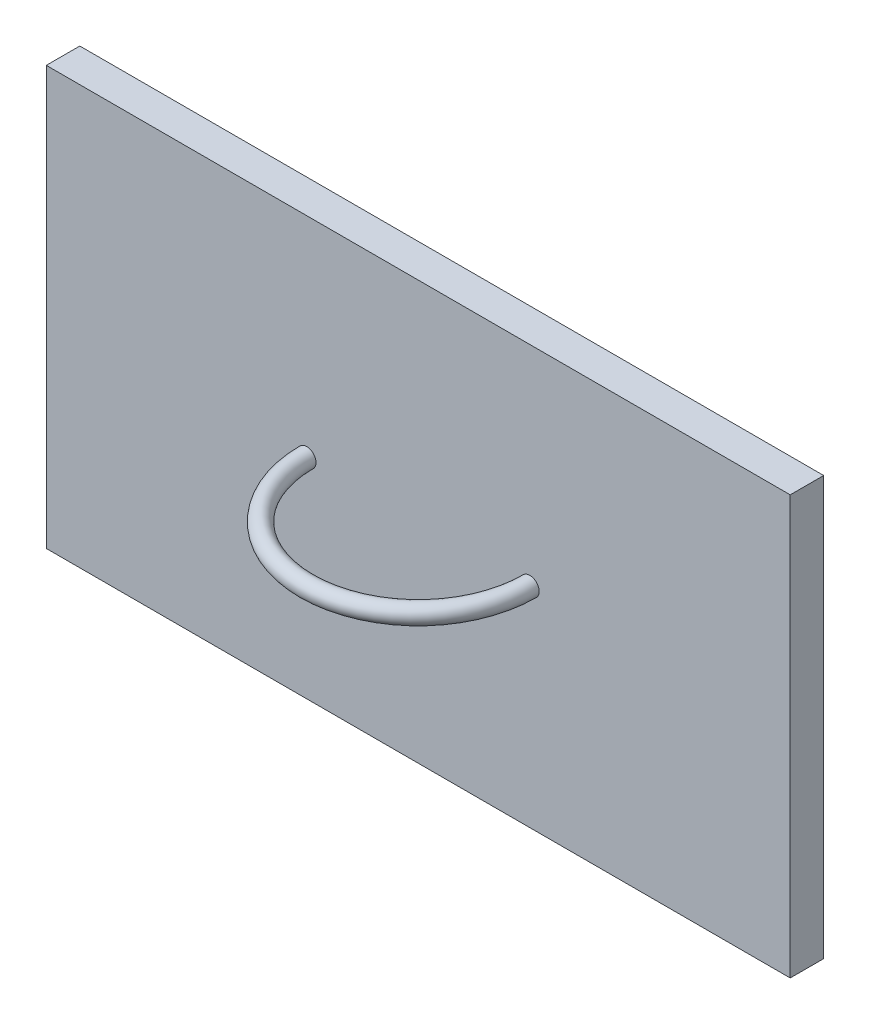
ISO-10303-21;
HEADER;
FILE_DESCRIPTION(('STEP AP214'),'2;1');
FILE_NAME('part.step','',(''),(''),'','','');
FILE_SCHEMA(('AUTOMOTIVE_DESIGN { 1 0 10303 214 1 1 1 1 }'));
ENDSEC;
DATA;
#1=APPLICATION_CONTEXT('core data for automotive mechanical design processes');
#2=APPLICATION_PROTOCOL_DEFINITION('international standard','automotive_design',2000,#1);
#3=PRODUCT_CONTEXT('',#1,'mechanical');
#4=PRODUCT('Part','Part','',(#3));
#5=PRODUCT_RELATED_PRODUCT_CATEGORY('part','',(#4));
#6=PRODUCT_DEFINITION_FORMATION('','',#4);
#7=PRODUCT_DEFINITION_CONTEXT('part definition',#1,'design');
#8=PRODUCT_DEFINITION('design','',#6,#7);
#9=PRODUCT_DEFINITION_SHAPE('','',#8);
#10=(LENGTH_UNIT() NAMED_UNIT(*) SI_UNIT(.MILLI.,.METRE.));
#11=(NAMED_UNIT(*) PLANE_ANGLE_UNIT() SI_UNIT($,.RADIAN.));
#12=(NAMED_UNIT(*) SI_UNIT($,.STERADIAN.) SOLID_ANGLE_UNIT());
#13=UNCERTAINTY_MEASURE_WITH_UNIT(LENGTH_MEASURE(1.E-05),#10,'distance_accuracy_value','');
#14=(GEOMETRIC_REPRESENTATION_CONTEXT(3) GLOBAL_UNCERTAINTY_ASSIGNED_CONTEXT((#13)) GLOBAL_UNIT_ASSIGNED_CONTEXT((#10,
#11,#12)) REPRESENTATION_CONTEXT('',''));
#15=CARTESIAN_POINT('',(0.,0.,0.));
#16=DIRECTION('',(0.,0.,1.));
#17=DIRECTION('',(1.,0.,0.));
#18=AXIS2_PLACEMENT_3D('',#15,#16,#17);
#19=CARTESIAN_POINT('',(0.,0.,18.));
#20=DIRECTION('',(0.,0.,-1.));
#21=DIRECTION('',(-1.,0.,0.));
#22=AXIS2_PLACEMENT_3D('',#19,#20,#21);
#23=PLANE('',#22);
#24=CARTESIAN_POINT('',(140.,112.5,18.));
#25=DIRECTION('',(0.,0.,-1.));
#26=DIRECTION('',(-1.,0.,0.));
#27=AXIS2_PLACEMENT_3D('',#24,#25,#26);
#28=CIRCLE('',#27,4.99999999999999);
#29=CARTESIAN_POINT('',(135.,112.5,18.));
#30=VERTEX_POINT('',#29);
#31=EDGE_CURVE('E44',#30,#30,#28,.F.);
#32=ORIENTED_EDGE('',*,*,#31,.F.);
#33=EDGE_LOOP('',(#32));
#34=FACE_BOUND('',#33,.T.);
#35=DIRECTION('',(0.,-1.,0.));
#36=VECTOR('',#35,1.);
#37=CARTESIAN_POINT('',(0.,0.,18.));
#38=LINE('',#37,#36);
#39=CARTESIAN_POINT('',(0.,225.,18.));
#40=VERTEX_POINT('',#39);
#41=CARTESIAN_POINT('',(0.,0.,18.));
#42=VERTEX_POINT('',#41);
#43=EDGE_CURVE('E88',#40,#42,#38,.T.);
#44=ORIENTED_EDGE('',*,*,#43,.T.);
#45=DIRECTION('',(1.,0.,0.));
#46=VECTOR('',#45,1.);
#47=CARTESIAN_POINT('',(0.,0.,18.));
#48=LINE('',#47,#46);
#49=CARTESIAN_POINT('',(400.,0.,18.));
#50=VERTEX_POINT('',#49);
#51=EDGE_CURVE('E83',#42,#50,#48,.T.);
#52=ORIENTED_EDGE('',*,*,#51,.T.);
#53=DIRECTION('',(0.,1.,0.));
#54=VECTOR('',#53,1.);
#55=CARTESIAN_POINT('',(400.,0.,18.));
#56=LINE('',#55,#54);
#57=CARTESIAN_POINT('',(400.,225.,18.));
#58=VERTEX_POINT('',#57);
#59=EDGE_CURVE('E86',#50,#58,#56,.T.);
#60=ORIENTED_EDGE('',*,*,#59,.T.);
#61=DIRECTION('',(-1.,0.,0.));
#62=VECTOR('',#61,1.);
#63=CARTESIAN_POINT('',(0.,225.,18.));
#64=LINE('',#63,#62);
#65=EDGE_CURVE('E52',#58,#40,#64,.T.);
#66=ORIENTED_EDGE('',*,*,#65,.T.);
#67=EDGE_LOOP('',(#44,#52,#60,#66));
#68=FACE_BOUND('',#67,.T.);
#69=CARTESIAN_POINT('',(260.,112.5,18.));
#70=DIRECTION('',(0.,0.,-1.));
#71=DIRECTION('',(-1.,0.,0.));
#72=AXIS2_PLACEMENT_3D('',#69,#70,#71);
#73=CIRCLE('',#72,4.99999999999999);
#74=CARTESIAN_POINT('',(265.,112.5,18.));
#75=VERTEX_POINT('',#74);
#76=EDGE_CURVE('E11',#75,#75,#73,.F.);
#77=ORIENTED_EDGE('',*,*,#76,.F.);
#78=EDGE_LOOP('',(#77));
#79=FACE_BOUND('',#78,.T.);
#80=ADVANCED_FACE('F35',(#34,#68,#79),#23,.F.);
#81=CARTESIAN_POINT('',(0.,0.,18.));
#82=DIRECTION('',(1.,0.,0.));
#83=DIRECTION('',(0.,0.,-1.));
#84=AXIS2_PLACEMENT_3D('',#81,#82,#83);
#85=PLANE('',#84);
#86=DIRECTION('',(0.,-1.,0.));
#87=VECTOR('',#86,1.);
#88=CARTESIAN_POINT('',(0.,0.,0.));
#89=LINE('',#88,#87);
#90=CARTESIAN_POINT('',(0.,225.,0.));
#91=VERTEX_POINT('',#90);
#92=CARTESIAN_POINT('',(0.,0.,0.));
#93=VERTEX_POINT('',#92);
#94=EDGE_CURVE('E103',#91,#93,#89,.T.);
#95=ORIENTED_EDGE('',*,*,#94,.T.);
#96=DIRECTION('',(0.,0.,-1.));
#97=VECTOR('',#96,1.);
#98=CARTESIAN_POINT('',(0.,0.,18.));
#99=LINE('',#98,#97);
#100=EDGE_CURVE('E94',#42,#93,#99,.T.);
#101=ORIENTED_EDGE('',*,*,#100,.F.);
#102=ORIENTED_EDGE('',*,*,#43,.F.);
#103=DIRECTION('',(0.,0.,-1.));
#104=VECTOR('',#103,1.);
#105=CARTESIAN_POINT('',(0.,225.,18.));
#106=LINE('',#105,#104);
#107=EDGE_CURVE('E99',#40,#91,#106,.T.);
#108=ORIENTED_EDGE('',*,*,#107,.T.);
#109=EDGE_LOOP('',(#95,#101,#102,#108));
#110=FACE_BOUND('',#109,.T.);
#111=ADVANCED_FACE('F37',(#110),#85,.F.);
#112=CARTESIAN_POINT('',(0.,0.,18.));
#113=DIRECTION('',(0.,1.,0.));
#114=DIRECTION('',(0.,0.,1.));
#115=AXIS2_PLACEMENT_3D('',#112,#113,#114);
#116=PLANE('',#115);
#117=DIRECTION('',(1.,0.,0.));
#118=VECTOR('',#117,1.);
#119=CARTESIAN_POINT('',(0.,0.,0.));
#120=LINE('',#119,#118);
#121=CARTESIAN_POINT('',(400.,0.,0.));
#122=VERTEX_POINT('',#121);
#123=EDGE_CURVE('E93',#93,#122,#120,.T.);
#124=ORIENTED_EDGE('',*,*,#123,.T.);
#125=DIRECTION('',(0.,0.,-1.));
#126=VECTOR('',#125,1.);
#127=CARTESIAN_POINT('',(400.,0.,18.));
#128=LINE('',#127,#126);
#129=EDGE_CURVE('E91',#50,#122,#128,.T.);
#130=ORIENTED_EDGE('',*,*,#129,.F.);
#131=ORIENTED_EDGE('',*,*,#51,.F.);
#132=ORIENTED_EDGE('',*,*,#100,.T.);
#133=EDGE_LOOP('',(#124,#130,#131,#132));
#134=FACE_BOUND('',#133,.T.);
#135=ADVANCED_FACE('F92',(#134),#116,.F.);
#136=CARTESIAN_POINT('',(400.,0.,18.));
#137=DIRECTION('',(-1.,0.,0.));
#138=DIRECTION('',(0.,0.,1.));
#139=AXIS2_PLACEMENT_3D('',#136,#137,#138);
#140=PLANE('',#139);
#141=DIRECTION('',(0.,1.,0.));
#142=VECTOR('',#141,1.);
#143=CARTESIAN_POINT('',(400.,0.,0.));
#144=LINE('',#143,#142);
#145=CARTESIAN_POINT('',(400.,225.,0.));
#146=VERTEX_POINT('',#145);
#147=EDGE_CURVE('E69',#122,#146,#144,.T.);
#148=ORIENTED_EDGE('',*,*,#147,.T.);
#149=DIRECTION('',(0.,0.,-1.));
#150=VECTOR('',#149,1.);
#151=CARTESIAN_POINT('',(400.,225.,18.));
#152=LINE('',#151,#150);
#153=EDGE_CURVE('E95',#58,#146,#152,.T.);
#154=ORIENTED_EDGE('',*,*,#153,.F.);
#155=ORIENTED_EDGE('',*,*,#59,.F.);
#156=ORIENTED_EDGE('',*,*,#129,.T.);
#157=EDGE_LOOP('',(#148,#154,#155,#156));
#158=FACE_BOUND('',#157,.T.);
#159=ADVANCED_FACE('F97',(#158),#140,.F.);
#160=CARTESIAN_POINT('',(0.,225.,18.));
#161=DIRECTION('',(0.,-1.,0.));
#162=DIRECTION('',(0.,0.,-1.));
#163=AXIS2_PLACEMENT_3D('',#160,#161,#162);
#164=PLANE('',#163);
#165=DIRECTION('',(-1.,0.,0.));
#166=VECTOR('',#165,1.);
#167=CARTESIAN_POINT('',(0.,225.,0.));
#168=LINE('',#167,#166);
#169=EDGE_CURVE('E75',#146,#91,#168,.T.);
#170=ORIENTED_EDGE('',*,*,#169,.T.);
#171=ORIENTED_EDGE('',*,*,#107,.F.);
#172=ORIENTED_EDGE('',*,*,#65,.F.);
#173=ORIENTED_EDGE('',*,*,#153,.T.);
#174=EDGE_LOOP('',(#170,#171,#172,#173));
#175=FACE_BOUND('',#174,.T.);
#176=ADVANCED_FACE('F127',(#175),#164,.F.);
#177=CARTESIAN_POINT('',(0.,0.,0.));
#178=DIRECTION('',(0.,0.,-1.));
#179=DIRECTION('',(-1.,0.,0.));
#180=AXIS2_PLACEMENT_3D('',#177,#178,#179);
#181=PLANE('',#180);
#182=ORIENTED_EDGE('',*,*,#94,.F.);
#183=ORIENTED_EDGE('',*,*,#169,.F.);
#184=ORIENTED_EDGE('',*,*,#147,.F.);
#185=ORIENTED_EDGE('',*,*,#123,.F.);
#186=EDGE_LOOP('',(#182,#183,#184,#185));
#187=FACE_BOUND('',#186,.T.);
#188=ADVANCED_FACE('F124',(#187),#181,.T.);
#189=CARTESIAN_POINT('',(200.,112.5,18.));
#190=DIRECTION('',(0.,-1.,0.));
#191=DIRECTION('',(0.,0.,-1.));
#192=AXIS2_PLACEMENT_3D('',#189,#190,#191);
#193=TOROIDAL_SURFACE('',#192,60.,4.99999999999999);
#194=CARTESIAN_POINT('',(200.,112.5,18.));
#195=DIRECTION('',(0.,-1.,0.));
#196=DIRECTION('',(0.,0.,-1.));
#197=AXIS2_PLACEMENT_3D('',#194,#195,#196);
#198=CIRCLE('',#197,65.);
#199=EDGE_CURVE('',#75,#30,#198,.T.);
#200=ORIENTED_EDGE('',*,*,#76,.T.);
#201=ORIENTED_EDGE('',*,*,#31,.T.);
#202=ORIENTED_EDGE('',*,*,#199,.T.);
#203=ORIENTED_EDGE('',*,*,#199,.F.);
#204=EDGE_LOOP('',(#200,#202,#201,#203));
#205=FACE_BOUND('',#204,.T.);
#206=ADVANCED_FACE('F114',(#205),#193,.T.);
#207=CLOSED_SHELL('',(#80,#111,#135,#159,#176,#188,#206));
#208=MANIFOLD_SOLID_BREP('B2',#207);
#209=ADVANCED_BREP_SHAPE_REPRESENTATION('',(#18,#208),#14);
#210=SHAPE_DEFINITION_REPRESENTATION(#9,#209);
ENDSEC;
END-ISO-10303-21;
